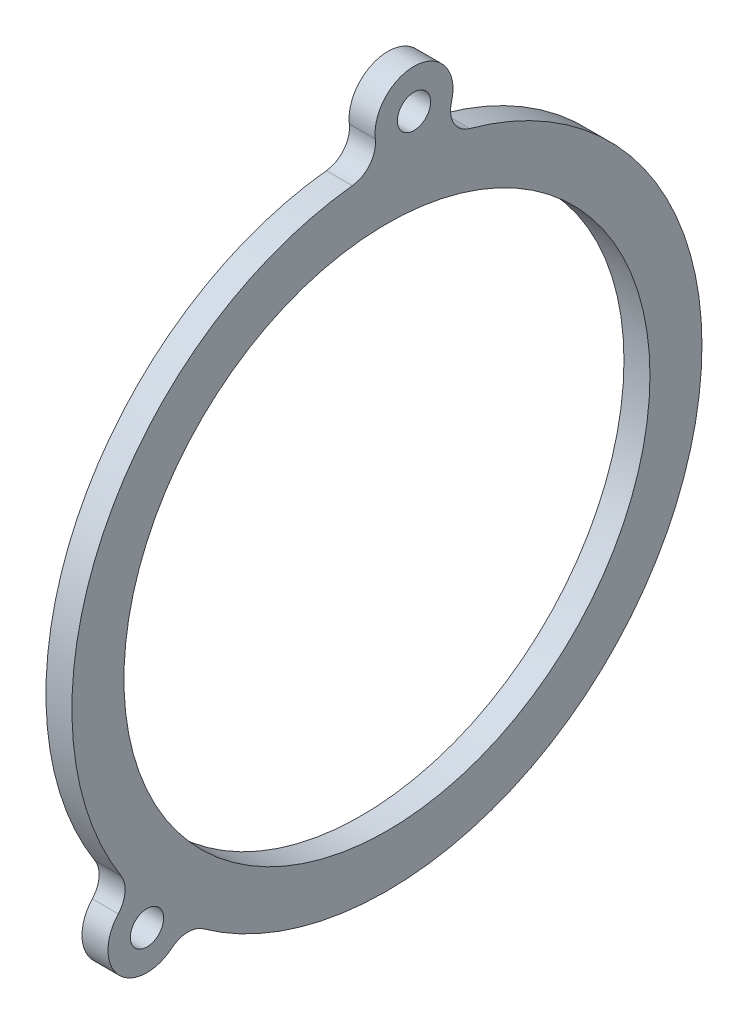
ISO-10303-21;
HEADER;
FILE_DESCRIPTION(('STEP AP214'),'2;1');
FILE_NAME('part.step','',(''),(''),'','','');
FILE_SCHEMA(('AUTOMOTIVE_DESIGN { 1 0 10303 214 1 1 1 1 }'));
ENDSEC;
DATA;
#1=APPLICATION_CONTEXT('core data for automotive mechanical design processes');
#2=APPLICATION_PROTOCOL_DEFINITION('international standard','automotive_design',2000,#1);
#3=PRODUCT_CONTEXT('',#1,'mechanical');
#4=PRODUCT('Part','Part','',(#3));
#5=PRODUCT_RELATED_PRODUCT_CATEGORY('part','',(#4));
#6=PRODUCT_DEFINITION_FORMATION('','',#4);
#7=PRODUCT_DEFINITION_CONTEXT('part definition',#1,'design');
#8=PRODUCT_DEFINITION('design','',#6,#7);
#9=PRODUCT_DEFINITION_SHAPE('','',#8);
#10=(LENGTH_UNIT() NAMED_UNIT(*) SI_UNIT(.MILLI.,.METRE.));
#11=(NAMED_UNIT(*) PLANE_ANGLE_UNIT() SI_UNIT($,.RADIAN.));
#12=(NAMED_UNIT(*) SI_UNIT($,.STERADIAN.) SOLID_ANGLE_UNIT());
#13=UNCERTAINTY_MEASURE_WITH_UNIT(LENGTH_MEASURE(1.E-05),#10,'distance_accuracy_value','');
#14=(GEOMETRIC_REPRESENTATION_CONTEXT(3) GLOBAL_UNCERTAINTY_ASSIGNED_CONTEXT((#13)) GLOBAL_UNIT_ASSIGNED_CONTEXT((#10,
#11,#12)) REPRESENTATION_CONTEXT('',''));
#15=CARTESIAN_POINT('',(0.,0.,0.));
#16=DIRECTION('',(0.,0.,1.));
#17=DIRECTION('',(1.,0.,0.));
#18=AXIS2_PLACEMENT_3D('',#15,#16,#17);
#19=CARTESIAN_POINT('',(3.175,-13.8532701784366,14.6578823742906));
#20=DIRECTION('',(1.,0.,0.));
#21=DIRECTION('',(0.,0.,-1.));
#22=AXIS2_PLACEMENT_3D('',#19,#20,#21);
#23=PLANE('',#22);
#24=CARTESIAN_POINT('',(3.175,42.3533544372828,-3.30640532118942));
#25=DIRECTION('',(1.,0.,0.));
#26=DIRECTION('',(0.,0.,-1.));
#27=AXIS2_PLACEMENT_3D('',#24,#25,#26);
#28=CIRCLE('',#27,2.032);
#29=CARTESIAN_POINT('',(3.175,42.3533544372828,-5.33840532118942));
#30=VERTEX_POINT('',#29);
#31=EDGE_CURVE('E235',#30,#30,#28,.T.);
#32=ORIENTED_EDGE('',*,*,#31,.F.);
#33=EDGE_LOOP('',(#32));
#34=FACE_BOUND('',#33,.T.);
#35=CARTESIAN_POINT('',(3.175,0.,0.));
#36=DIRECTION('',(1.,0.,0.));
#37=DIRECTION('',(0.,0.,-1.));
#38=AXIS2_PLACEMENT_3D('',#35,#36,#37);
#39=CIRCLE('',#38,38.481);
#40=CARTESIAN_POINT('',(3.175,38.2483017038194,4.22549142391851));
#41=VERTEX_POINT('',#40);
#42=CARTESIAN_POINT('',(3.175,-20.6340938739943,32.4810949784515));
#43=VERTEX_POINT('',#42);
#44=EDGE_CURVE('E178',#41,#43,#39,.T.);
#45=ORIENTED_EDGE('',*,*,#44,.T.);
#46=CARTESIAN_POINT('',(3.175,-22.3365768668981,35.1610533100069));
#47=DIRECTION('',(1.,0.,0.));
#48=DIRECTION('',(0.,0.,-1.));
#49=AXIS2_PLACEMENT_3D('',#46,#47,#48);
#50=CIRCLE('',#49,3.175);
#51=CARTESIAN_POINT('',(3.175,-24.4845622628881,32.8229378854366));
#52=VERTEX_POINT('',#51);
#53=EDGE_CURVE('E201',#43,#52,#50,.F.);
#54=ORIENTED_EDGE('',*,*,#53,.T.);
#55=CARTESIAN_POINT('',(3.175,-27.7065403568731,29.3157647485811));
#56=DIRECTION('',(1.,0.,0.));
#57=DIRECTION('',(0.,0.,-1.));
#58=AXIS2_PLACEMENT_3D('',#55,#56,#57);
#59=CIRCLE('',#58,4.7625);
#60=CARTESIAN_POINT('',(3.175,-31.38984148866,26.29670876656));
#61=VERTEX_POINT('',#60);
#62=EDGE_CURVE('E176',#52,#61,#59,.T.);
#63=ORIENTED_EDGE('',*,*,#62,.T.);
#64=CARTESIAN_POINT('',(3.175,-33.8453755765179,24.2840047785459));
#65=DIRECTION('',(1.,0.,0.));
#66=DIRECTION('',(0.,0.,-1.));
#67=AXIS2_PLACEMENT_3D('',#64,#65,#66);
#68=CIRCLE('',#67,3.175);
#69=CARTESIAN_POINT('',(3.175,-31.265697560015,22.4330897801812));
#70=VERTEX_POINT('',#69);
#71=EDGE_CURVE('E141',#61,#70,#68,.F.);
#72=ORIENTED_EDGE('',*,*,#71,.T.);
#73=CARTESIAN_POINT('',(3.175,0.,0.));
#74=DIRECTION('',(1.,0.,0.));
#75=DIRECTION('',(0.,0.,-1.));
#76=AXIS2_PLACEMENT_3D('',#73,#74,#75);
#77=CIRCLE('',#76,38.481);
#78=CARTESIAN_POINT('',(3.175,37.1291712321495,-10.1099952825765));
#79=VERTEX_POINT('',#78);
#80=EDGE_CURVE('E150',#70,#79,#77,.T.);
#81=ORIENTED_EDGE('',*,*,#80,.T.);
#82=CARTESIAN_POINT('',(3.175,40.1926342050992,-10.9441533091917));
#83=DIRECTION('',(1.,0.,0.));
#84=DIRECTION('',(0.,0.,-1.));
#85=AXIS2_PLACEMENT_3D('',#82,#83,#84);
#86=CIRCLE('',#85,3.175);
#87=CARTESIAN_POINT('',(3.175,41.0569222979726,-7.88905411399078));
#88=VERTEX_POINT('',#87);
#89=EDGE_CURVE('E75',#79,#88,#86,.F.);
#90=ORIENTED_EDGE('',*,*,#89,.T.);
#91=CARTESIAN_POINT('',(3.175,42.3533544372828,-3.30640532118942));
#92=DIRECTION('',(1.,0.,0.));
#93=DIRECTION('',(0.,0.,-1.));
#94=AXIS2_PLACEMENT_3D('',#91,#92,#93);
#95=CIRCLE('',#94,4.76250000000001);
#96=CARTESIAN_POINT('',(3.175,41.783803079572,1.42191546963367));
#97=VERTEX_POINT('',#96);
#98=EDGE_CURVE('E219',#88,#97,#95,.T.);
#99=ORIENTED_EDGE('',*,*,#98,.T.);
#100=CARTESIAN_POINT('',(3.175,41.4041021744315,4.57412933018241));
#101=DIRECTION('',(1.,0.,0.));
#102=DIRECTION('',(0.,0.,-1.));
#103=AXIS2_PLACEMENT_3D('',#100,#101,#102);
#104=CIRCLE('',#103,3.175);
#105=EDGE_CURVE('E11',#97,#41,#104,.F.);
#106=ORIENTED_EDGE('',*,*,#105,.T.);
#107=EDGE_LOOP('',(#45,#54,#63,#72,#81,#90,#99,#106));
#108=FACE_BOUND('',#107,.T.);
#109=CARTESIAN_POINT('',(3.175,0.,0.));
#110=DIRECTION('',(1.,0.,0.));
#111=DIRECTION('',(0.,0.,-1.));
#112=AXIS2_PLACEMENT_3D('',#109,#110,#111);
#113=CIRCLE('',#112,32.131);
#114=CARTESIAN_POINT('',(3.175,0.,-32.131));
#115=VERTEX_POINT('',#114);
#116=EDGE_CURVE('E169',#115,#115,#113,.T.);
#117=ORIENTED_EDGE('',*,*,#116,.F.);
#118=EDGE_LOOP('',(#117));
#119=FACE_BOUND('',#118,.T.);
#120=CARTESIAN_POINT('',(3.175,-27.7065403568731,29.3157647485811));
#121=DIRECTION('',(1.,0.,0.));
#122=DIRECTION('',(0.,0.,-1.));
#123=AXIS2_PLACEMENT_3D('',#120,#121,#122);
#124=CIRCLE('',#123,2.032);
#125=CARTESIAN_POINT('',(3.175,-27.7065403568731,27.2837647485811));
#126=VERTEX_POINT('',#125);
#127=EDGE_CURVE('E242',#126,#126,#124,.T.);
#128=ORIENTED_EDGE('',*,*,#127,.F.);
#129=EDGE_LOOP('',(#128));
#130=FACE_BOUND('',#129,.T.);
#131=ADVANCED_FACE('F49',(#34,#108,#119,#130),#23,.T.);
#132=CARTESIAN_POINT('',(0.,-13.8532701784366,14.6578823742906));
#133=DIRECTION('',(1.,0.,0.));
#134=DIRECTION('',(0.,0.,-1.));
#135=AXIS2_PLACEMENT_3D('',#132,#133,#134);
#136=PLANE('',#135);
#137=CARTESIAN_POINT('',(0.,-27.7065403568731,29.3157647485811));
#138=DIRECTION('',(1.,0.,0.));
#139=DIRECTION('',(0.,0.,-1.));
#140=AXIS2_PLACEMENT_3D('',#137,#138,#139);
#141=CIRCLE('',#140,4.7625);
#142=CARTESIAN_POINT('',(0.,-24.4845622628881,32.8229378854366));
#143=VERTEX_POINT('',#142);
#144=CARTESIAN_POINT('',(0.,-31.38984148866,26.29670876656));
#145=VERTEX_POINT('',#144);
#146=EDGE_CURVE('E161',#143,#145,#141,.T.);
#147=ORIENTED_EDGE('',*,*,#146,.F.);
#148=CARTESIAN_POINT('',(0.,-22.3365768668981,35.1610533100069));
#149=DIRECTION('',(1.,0.,0.));
#150=DIRECTION('',(0.,0.,-1.));
#151=AXIS2_PLACEMENT_3D('',#148,#149,#150);
#152=CIRCLE('',#151,3.175);
#153=CARTESIAN_POINT('',(0.,-20.6340938739943,32.4810949784515));
#154=VERTEX_POINT('',#153);
#155=EDGE_CURVE('E198',#143,#154,#152,.T.);
#156=ORIENTED_EDGE('',*,*,#155,.T.);
#157=CARTESIAN_POINT('',(0.,0.,0.));
#158=DIRECTION('',(1.,0.,0.));
#159=DIRECTION('',(0.,0.,-1.));
#160=AXIS2_PLACEMENT_3D('',#157,#158,#159);
#161=CIRCLE('',#160,38.481);
#162=CARTESIAN_POINT('',(0.,38.2483017038194,4.22549142391851));
#163=VERTEX_POINT('',#162);
#164=EDGE_CURVE('E166',#163,#154,#161,.T.);
#165=ORIENTED_EDGE('',*,*,#164,.F.);
#166=CARTESIAN_POINT('',(0.,41.4041021744315,4.57412933018241));
#167=DIRECTION('',(1.,0.,0.));
#168=DIRECTION('',(0.,0.,-1.));
#169=AXIS2_PLACEMENT_3D('',#166,#167,#168);
#170=CIRCLE('',#169,3.175);
#171=CARTESIAN_POINT('',(0.,41.783803079572,1.42191546963367));
#172=VERTEX_POINT('',#171);
#173=EDGE_CURVE('E58',#163,#172,#170,.T.);
#174=ORIENTED_EDGE('',*,*,#173,.T.);
#175=CARTESIAN_POINT('',(0.,42.3533544372828,-3.30640532118942));
#176=DIRECTION('',(1.,0.,0.));
#177=DIRECTION('',(0.,0.,-1.));
#178=AXIS2_PLACEMENT_3D('',#175,#176,#177);
#179=CIRCLE('',#178,4.76250000000001);
#180=CARTESIAN_POINT('',(0.,41.0569222979726,-7.88905411399078));
#181=VERTEX_POINT('',#180);
#182=EDGE_CURVE('E160',#181,#172,#179,.T.);
#183=ORIENTED_EDGE('',*,*,#182,.F.);
#184=CARTESIAN_POINT('',(0.,40.1926342050992,-10.9441533091917));
#185=DIRECTION('',(1.,0.,0.));
#186=DIRECTION('',(0.,0.,-1.));
#187=AXIS2_PLACEMENT_3D('',#184,#185,#186);
#188=CIRCLE('',#187,3.175);
#189=CARTESIAN_POINT('',(0.,37.1291712321495,-10.1099952825765));
#190=VERTEX_POINT('',#189);
#191=EDGE_CURVE('E158',#181,#190,#188,.T.);
#192=ORIENTED_EDGE('',*,*,#191,.T.);
#193=CARTESIAN_POINT('',(0.,0.,0.));
#194=DIRECTION('',(1.,0.,0.));
#195=DIRECTION('',(0.,0.,-1.));
#196=AXIS2_PLACEMENT_3D('',#193,#194,#195);
#197=CIRCLE('',#196,38.481);
#198=CARTESIAN_POINT('',(0.,-31.265697560015,22.4330897801812));
#199=VERTEX_POINT('',#198);
#200=EDGE_CURVE('E148',#199,#190,#197,.T.);
#201=ORIENTED_EDGE('',*,*,#200,.F.);
#202=CARTESIAN_POINT('',(0.,-33.8453755765179,24.2840047785459));
#203=DIRECTION('',(1.,0.,0.));
#204=DIRECTION('',(0.,0.,-1.));
#205=AXIS2_PLACEMENT_3D('',#202,#203,#204);
#206=CIRCLE('',#205,3.175);
#207=EDGE_CURVE('E130',#199,#145,#206,.T.);
#208=ORIENTED_EDGE('',*,*,#207,.T.);
#209=EDGE_LOOP('',(#147,#156,#165,#174,#183,#192,#201,#208));
#210=FACE_BOUND('',#209,.T.);
#211=CARTESIAN_POINT('',(0.,0.,0.));
#212=DIRECTION('',(1.,0.,0.));
#213=DIRECTION('',(0.,0.,-1.));
#214=AXIS2_PLACEMENT_3D('',#211,#212,#213);
#215=CIRCLE('',#214,32.131);
#216=CARTESIAN_POINT('',(0.,0.,-32.131));
#217=VERTEX_POINT('',#216);
#218=EDGE_CURVE('E232',#217,#217,#215,.T.);
#219=ORIENTED_EDGE('',*,*,#218,.T.);
#220=EDGE_LOOP('',(#219));
#221=FACE_BOUND('',#220,.T.);
#222=CARTESIAN_POINT('',(0.,42.3533544372828,-3.30640532118942));
#223=DIRECTION('',(1.,0.,0.));
#224=DIRECTION('',(0.,0.,-1.));
#225=AXIS2_PLACEMENT_3D('',#222,#223,#224);
#226=CIRCLE('',#225,2.032);
#227=CARTESIAN_POINT('',(0.,42.3533544372828,-5.33840532118942));
#228=VERTEX_POINT('',#227);
#229=EDGE_CURVE('E238',#228,#228,#226,.T.);
#230=ORIENTED_EDGE('',*,*,#229,.T.);
#231=EDGE_LOOP('',(#230));
#232=FACE_BOUND('',#231,.T.);
#233=CARTESIAN_POINT('',(0.,-27.7065403568731,29.3157647485811));
#234=DIRECTION('',(1.,0.,0.));
#235=DIRECTION('',(0.,0.,-1.));
#236=AXIS2_PLACEMENT_3D('',#233,#234,#235);
#237=CIRCLE('',#236,2.032);
#238=CARTESIAN_POINT('',(0.,-27.7065403568731,27.2837647485811));
#239=VERTEX_POINT('',#238);
#240=EDGE_CURVE('E245',#239,#239,#237,.T.);
#241=ORIENTED_EDGE('',*,*,#240,.T.);
#242=EDGE_LOOP('',(#241));
#243=FACE_BOUND('',#242,.T.);
#244=ADVANCED_FACE('F155',(#210,#221,#232,#243),#136,.F.);
#245=CARTESIAN_POINT('',(3.175,-27.7065403568731,29.3157647485811));
#246=DIRECTION('',(-1.,0.,0.));
#247=DIRECTION('',(0.,0.,1.));
#248=AXIS2_PLACEMENT_3D('',#245,#246,#247);
#249=CYLINDRICAL_SURFACE('',#248,4.7625);
#250=ORIENTED_EDGE('',*,*,#146,.T.);
#251=DIRECTION('',(-1.,0.,0.));
#252=VECTOR('',#251,1.);
#253=CARTESIAN_POINT('',(3.175,-31.38984148866,26.29670876656));
#254=LINE('',#253,#252);
#255=EDGE_CURVE('E135',#145,#61,#254,.F.);
#256=ORIENTED_EDGE('',*,*,#255,.T.);
#257=ORIENTED_EDGE('',*,*,#62,.F.);
#258=DIRECTION('',(-1.,0.,0.));
#259=VECTOR('',#258,1.);
#260=CARTESIAN_POINT('',(3.175,-24.4845622628881,32.8229378854366));
#261=LINE('',#260,#259);
#262=EDGE_CURVE('E152',#52,#143,#261,.T.);
#263=ORIENTED_EDGE('',*,*,#262,.T.);
#264=EDGE_LOOP('',(#250,#256,#257,#263));
#265=FACE_BOUND('',#264,.T.);
#266=ADVANCED_FACE('F262',(#265),#249,.T.);
#267=CARTESIAN_POINT('',(3.175,0.,0.));
#268=DIRECTION('',(-1.,0.,0.));
#269=DIRECTION('',(0.,0.,1.));
#270=AXIS2_PLACEMENT_3D('',#267,#268,#269);
#271=CYLINDRICAL_SURFACE('',#270,38.481);
#272=ORIENTED_EDGE('',*,*,#80,.F.);
#273=DIRECTION('',(-1.,0.,0.));
#274=VECTOR('',#273,1.);
#275=CARTESIAN_POINT('',(3.175,-31.265697560015,22.4330897801812));
#276=LINE('',#275,#274);
#277=EDGE_CURVE('E134',#70,#199,#276,.T.);
#278=ORIENTED_EDGE('',*,*,#277,.T.);
#279=ORIENTED_EDGE('',*,*,#200,.T.);
#280=DIRECTION('',(-1.,0.,0.));
#281=VECTOR('',#280,1.);
#282=CARTESIAN_POINT('',(3.175,37.1291712321495,-10.1099952825765));
#283=LINE('',#282,#281);
#284=EDGE_CURVE('E153',#190,#79,#283,.F.);
#285=ORIENTED_EDGE('',*,*,#284,.T.);
#286=EDGE_LOOP('',(#272,#278,#279,#285));
#287=FACE_BOUND('',#286,.T.);
#288=ADVANCED_FACE('F147',(#287),#271,.T.);
#289=CARTESIAN_POINT('',(3.175,42.3533544372828,-3.30640532118942));
#290=DIRECTION('',(-1.,0.,0.));
#291=DIRECTION('',(0.,0.,1.));
#292=AXIS2_PLACEMENT_3D('',#289,#290,#291);
#293=CYLINDRICAL_SURFACE('',#292,4.76250000000001);
#294=ORIENTED_EDGE('',*,*,#98,.F.);
#295=DIRECTION('',(-1.,0.,0.));
#296=VECTOR('',#295,1.);
#297=CARTESIAN_POINT('',(3.175,41.0569222979726,-7.88905411399078));
#298=LINE('',#297,#296);
#299=EDGE_CURVE('E142',#88,#181,#298,.T.);
#300=ORIENTED_EDGE('',*,*,#299,.T.);
#301=ORIENTED_EDGE('',*,*,#182,.T.);
#302=DIRECTION('',(-1.,0.,0.));
#303=VECTOR('',#302,1.);
#304=CARTESIAN_POINT('',(3.175,41.783803079572,1.42191546963367));
#305=LINE('',#304,#303);
#306=EDGE_CURVE('E68',#172,#97,#305,.F.);
#307=ORIENTED_EDGE('',*,*,#306,.T.);
#308=EDGE_LOOP('',(#294,#300,#301,#307));
#309=FACE_BOUND('',#308,.T.);
#310=ADVANCED_FACE('F212',(#309),#293,.T.);
#311=CARTESIAN_POINT('',(3.175,0.,0.));
#312=DIRECTION('',(-1.,0.,0.));
#313=DIRECTION('',(0.,0.,1.));
#314=AXIS2_PLACEMENT_3D('',#311,#312,#313);
#315=CYLINDRICAL_SURFACE('',#314,38.481);
#316=ORIENTED_EDGE('',*,*,#164,.T.);
#317=DIRECTION('',(-1.,0.,0.));
#318=VECTOR('',#317,1.);
#319=CARTESIAN_POINT('',(3.175,-20.6340938739943,32.4810949784515));
#320=LINE('',#319,#318);
#321=EDGE_CURVE('E189',#154,#43,#320,.F.);
#322=ORIENTED_EDGE('',*,*,#321,.T.);
#323=ORIENTED_EDGE('',*,*,#44,.F.);
#324=DIRECTION('',(-1.,0.,0.));
#325=VECTOR('',#324,1.);
#326=CARTESIAN_POINT('',(3.175,38.2483017038194,4.22549142391851));
#327=LINE('',#326,#325);
#328=EDGE_CURVE('E185',#41,#163,#327,.T.);
#329=ORIENTED_EDGE('',*,*,#328,.T.);
#330=EDGE_LOOP('',(#316,#322,#323,#329));
#331=FACE_BOUND('',#330,.T.);
#332=ADVANCED_FACE('F221',(#331),#315,.T.);
#333=CARTESIAN_POINT('',(3.175,0.,0.));
#334=DIRECTION('',(-1.,0.,0.));
#335=DIRECTION('',(0.,0.,1.));
#336=AXIS2_PLACEMENT_3D('',#333,#334,#335);
#337=CYLINDRICAL_SURFACE('',#336,32.131);
#338=ORIENTED_EDGE('',*,*,#116,.T.);
#339=EDGE_LOOP('',(#338));
#340=FACE_BOUND('',#339,.T.);
#341=ORIENTED_EDGE('',*,*,#218,.F.);
#342=EDGE_LOOP('',(#341));
#343=FACE_BOUND('',#342,.T.);
#344=ADVANCED_FACE('F266',(#340,#343),#337,.F.);
#345=CARTESIAN_POINT('',(3.175,42.3533544372828,-3.30640532118942));
#346=DIRECTION('',(-1.,0.,0.));
#347=DIRECTION('',(0.,0.,1.));
#348=AXIS2_PLACEMENT_3D('',#345,#346,#347);
#349=CYLINDRICAL_SURFACE('',#348,2.032);
#350=ORIENTED_EDGE('',*,*,#31,.T.);
#351=EDGE_LOOP('',(#350));
#352=FACE_BOUND('',#351,.T.);
#353=ORIENTED_EDGE('',*,*,#229,.F.);
#354=EDGE_LOOP('',(#353));
#355=FACE_BOUND('',#354,.T.);
#356=ADVANCED_FACE('F321',(#352,#355),#349,.F.);
#357=CARTESIAN_POINT('',(3.175,-27.7065403568731,29.3157647485811));
#358=DIRECTION('',(-1.,0.,0.));
#359=DIRECTION('',(0.,0.,1.));
#360=AXIS2_PLACEMENT_3D('',#357,#358,#359);
#361=CYLINDRICAL_SURFACE('',#360,2.032);
#362=ORIENTED_EDGE('',*,*,#127,.T.);
#363=EDGE_LOOP('',(#362));
#364=FACE_BOUND('',#363,.T.);
#365=ORIENTED_EDGE('',*,*,#240,.F.);
#366=EDGE_LOOP('',(#365));
#367=FACE_BOUND('',#366,.T.);
#368=ADVANCED_FACE('F253',(#364,#367),#361,.F.);
#369=CARTESIAN_POINT('',(3.175,-33.8453755765179,24.2840047785459));
#370=DIRECTION('',(1.,0.,0.));
#371=DIRECTION('',(0.,0.,-1.));
#372=AXIS2_PLACEMENT_3D('',#369,#370,#371);
#373=CYLINDRICAL_SURFACE('',#372,3.175);
#374=ORIENTED_EDGE('',*,*,#71,.F.);
#375=ORIENTED_EDGE('',*,*,#255,.F.);
#376=ORIENTED_EDGE('',*,*,#207,.F.);
#377=ORIENTED_EDGE('',*,*,#277,.F.);
#378=EDGE_LOOP('',(#374,#375,#376,#377));
#379=FACE_BOUND('',#378,.T.);
#380=ADVANCED_FACE('F133',(#379),#373,.F.);
#381=CARTESIAN_POINT('',(3.175,-22.3365768668981,35.1610533100069));
#382=DIRECTION('',(1.,0.,0.));
#383=DIRECTION('',(0.,0.,-1.));
#384=AXIS2_PLACEMENT_3D('',#381,#382,#383);
#385=CYLINDRICAL_SURFACE('',#384,3.175);
#386=ORIENTED_EDGE('',*,*,#53,.F.);
#387=ORIENTED_EDGE('',*,*,#321,.F.);
#388=ORIENTED_EDGE('',*,*,#155,.F.);
#389=ORIENTED_EDGE('',*,*,#262,.F.);
#390=EDGE_LOOP('',(#386,#387,#388,#389));
#391=FACE_BOUND('',#390,.T.);
#392=ADVANCED_FACE('F280',(#391),#385,.F.);
#393=CARTESIAN_POINT('',(3.175,40.1926342050992,-10.9441533091917));
#394=DIRECTION('',(1.,0.,0.));
#395=DIRECTION('',(0.,0.,-1.));
#396=AXIS2_PLACEMENT_3D('',#393,#394,#395);
#397=CYLINDRICAL_SURFACE('',#396,3.175);
#398=ORIENTED_EDGE('',*,*,#89,.F.);
#399=ORIENTED_EDGE('',*,*,#284,.F.);
#400=ORIENTED_EDGE('',*,*,#191,.F.);
#401=ORIENTED_EDGE('',*,*,#299,.F.);
#402=EDGE_LOOP('',(#398,#399,#400,#401));
#403=FACE_BOUND('',#402,.T.);
#404=ADVANCED_FACE('F282',(#403),#397,.F.);
#405=CARTESIAN_POINT('',(3.175,41.4041021744315,4.57412933018241));
#406=DIRECTION('',(1.,0.,0.));
#407=DIRECTION('',(0.,0.,-1.));
#408=AXIS2_PLACEMENT_3D('',#405,#406,#407);
#409=CYLINDRICAL_SURFACE('',#408,3.175);
#410=ORIENTED_EDGE('',*,*,#105,.F.);
#411=ORIENTED_EDGE('',*,*,#306,.F.);
#412=ORIENTED_EDGE('',*,*,#173,.F.);
#413=ORIENTED_EDGE('',*,*,#328,.F.);
#414=EDGE_LOOP('',(#410,#411,#412,#413));
#415=FACE_BOUND('',#414,.T.);
#416=ADVANCED_FACE('F51',(#415),#409,.F.);
#417=CLOSED_SHELL('',(#131,#244,#266,#288,#310,#332,#344,#356,#368,#380,#392,#404,#416));
#418=MANIFOLD_SOLID_BREP('B2',#417);
#419=ADVANCED_BREP_SHAPE_REPRESENTATION('',(#18,#418),#14);
#420=SHAPE_DEFINITION_REPRESENTATION(#9,#419);
ENDSEC;
END-ISO-10303-21;
